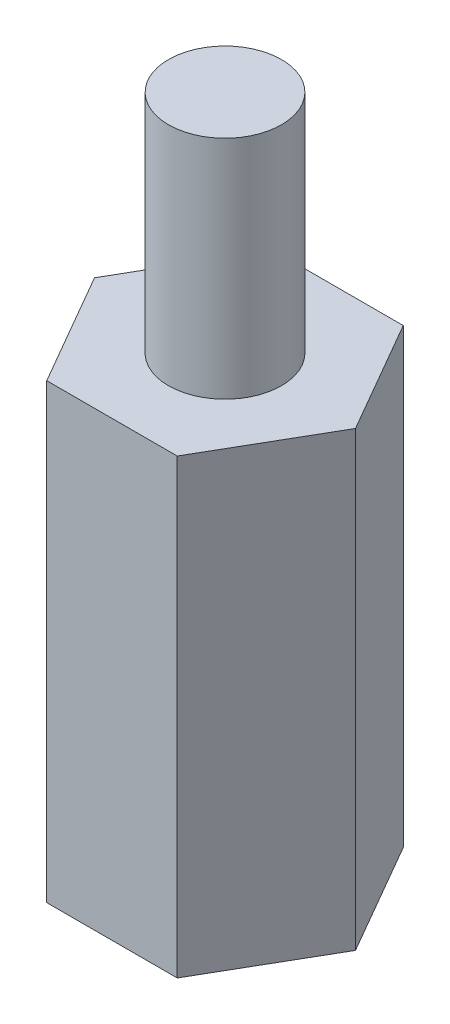
ISO-10303-21;
HEADER;
FILE_DESCRIPTION(('STEP AP214'),'2;1');
FILE_NAME('part.step','',(''),(''),'','','');
FILE_SCHEMA(('AUTOMOTIVE_DESIGN { 1 0 10303 214 1 1 1 1 }'));
ENDSEC;
DATA;
#1=APPLICATION_CONTEXT('core data for automotive mechanical design processes');
#2=APPLICATION_PROTOCOL_DEFINITION('international standard','automotive_design',2000,#1);
#3=PRODUCT_CONTEXT('',#1,'mechanical');
#4=PRODUCT('Part','Part','',(#3));
#5=PRODUCT_RELATED_PRODUCT_CATEGORY('part','',(#4));
#6=PRODUCT_DEFINITION_FORMATION('','',#4);
#7=PRODUCT_DEFINITION_CONTEXT('part definition',#1,'design');
#8=PRODUCT_DEFINITION('design','',#6,#7);
#9=PRODUCT_DEFINITION_SHAPE('','',#8);
#10=(LENGTH_UNIT() NAMED_UNIT(*) SI_UNIT(.MILLI.,.METRE.));
#11=(NAMED_UNIT(*) PLANE_ANGLE_UNIT() SI_UNIT($,.RADIAN.));
#12=(NAMED_UNIT(*) SI_UNIT($,.STERADIAN.) SOLID_ANGLE_UNIT());
#13=UNCERTAINTY_MEASURE_WITH_UNIT(LENGTH_MEASURE(1.E-05),#10,'distance_accuracy_value','');
#14=(GEOMETRIC_REPRESENTATION_CONTEXT(3) GLOBAL_UNCERTAINTY_ASSIGNED_CONTEXT((#13)) GLOBAL_UNIT_ASSIGNED_CONTEXT((#10,
#11,#12)) REPRESENTATION_CONTEXT('',''));
#15=CARTESIAN_POINT('',(0.,0.,0.));
#16=DIRECTION('',(0.,0.,1.));
#17=DIRECTION('',(1.,0.,0.));
#18=AXIS2_PLACEMENT_3D('',#15,#16,#17);
#19=CARTESIAN_POINT('',(2.88675134594813,10.,0.));
#20=DIRECTION('',(0.,1.,0.));
#21=DIRECTION('',(0.,0.,1.));
#22=AXIS2_PLACEMENT_3D('',#19,#20,#21);
#23=PLANE('',#22);
#24=DIRECTION('',(0.5,0.,-0.866025403784439));
#25=VECTOR('',#24,1.);
#26=CARTESIAN_POINT('',(1.44337567297407,10.,2.5));
#27=LINE('',#26,#25);
#28=CARTESIAN_POINT('',(1.44337567297407,10.,2.5));
#29=VERTEX_POINT('',#28);
#30=CARTESIAN_POINT('',(2.88675134594813,10.,0.));
#31=VERTEX_POINT('',#30);
#32=EDGE_CURVE('E135',#29,#31,#27,.T.);
#33=ORIENTED_EDGE('',*,*,#32,.T.);
#34=DIRECTION('',(-0.5,0.,-0.866025403784438));
#35=VECTOR('',#34,1.);
#36=CARTESIAN_POINT('',(2.88675134594813,10.,0.));
#37=LINE('',#36,#35);
#38=CARTESIAN_POINT('',(1.44337567297406,10.,-2.5));
#39=VERTEX_POINT('',#38);
#40=EDGE_CURVE('E92',#31,#39,#37,.T.);
#41=ORIENTED_EDGE('',*,*,#40,.T.);
#42=DIRECTION('',(-1.,0.,0.));
#43=VECTOR('',#42,1.);
#44=CARTESIAN_POINT('',(1.44337567297406,10.,-2.5));
#45=LINE('',#44,#43);
#46=CARTESIAN_POINT('',(-1.44337567297406,10.,-2.5));
#47=VERTEX_POINT('',#46);
#48=EDGE_CURVE('E106',#39,#47,#45,.T.);
#49=ORIENTED_EDGE('',*,*,#48,.T.);
#50=DIRECTION('',(-0.5,0.,0.866025403784439));
#51=VECTOR('',#50,1.);
#52=CARTESIAN_POINT('',(-1.44337567297406,10.,-2.5));
#53=LINE('',#52,#51);
#54=CARTESIAN_POINT('',(-2.88675134594813,10.,0.));
#55=VERTEX_POINT('',#54);
#56=EDGE_CURVE('E100',#47,#55,#53,.T.);
#57=ORIENTED_EDGE('',*,*,#56,.T.);
#58=DIRECTION('',(0.5,0.,0.866025403784439));
#59=VECTOR('',#58,1.);
#60=CARTESIAN_POINT('',(-2.88675134594813,10.,0.));
#61=LINE('',#60,#59);
#62=CARTESIAN_POINT('',(-1.44337567297406,10.,2.5));
#63=VERTEX_POINT('',#62);
#64=EDGE_CURVE('E104',#55,#63,#61,.T.);
#65=ORIENTED_EDGE('',*,*,#64,.T.);
#66=DIRECTION('',(1.,0.,0.));
#67=VECTOR('',#66,1.);
#68=CARTESIAN_POINT('',(-1.44337567297406,10.,2.5));
#69=LINE('',#68,#67);
#70=EDGE_CURVE('E54',#63,#29,#69,.T.);
#71=ORIENTED_EDGE('',*,*,#70,.T.);
#72=EDGE_LOOP('',(#33,#41,#49,#57,#65,#71));
#73=FACE_BOUND('',#72,.T.);
#74=CARTESIAN_POINT('',(0.,10.,0.));
#75=DIRECTION('',(0.,1.,0.));
#76=DIRECTION('',(0.,0.,1.));
#77=AXIS2_PLACEMENT_3D('',#74,#75,#76);
#78=CIRCLE('',#77,1.25);
#79=CARTESIAN_POINT('',(0.,10.,1.25));
#80=VERTEX_POINT('',#79);
#81=EDGE_CURVE('E186',#80,#80,#78,.T.);
#82=ORIENTED_EDGE('',*,*,#81,.F.);
#83=EDGE_LOOP('',(#82));
#84=FACE_BOUND('',#83,.T.);
#85=ADVANCED_FACE('F37',(#73,#84),#23,.T.);
#86=CARTESIAN_POINT('',(1.44337567297407,10.,2.5));
#87=DIRECTION('',(-0.866025403784439,0.,-0.5));
#88=DIRECTION('',(-0.5,0.,0.866025403784439));
#89=AXIS2_PLACEMENT_3D('',#86,#87,#88);
#90=PLANE('',#89);
#91=DIRECTION('',(0.5,0.,-0.866025403784439));
#92=VECTOR('',#91,1.);
#93=CARTESIAN_POINT('',(1.44337567297407,0.,2.5));
#94=LINE('',#93,#92);
#95=CARTESIAN_POINT('',(1.44337567297407,0.,2.5));
#96=VERTEX_POINT('',#95);
#97=CARTESIAN_POINT('',(2.88675134594813,0.,0.));
#98=VERTEX_POINT('',#97);
#99=EDGE_CURVE('E124',#96,#98,#94,.T.);
#100=ORIENTED_EDGE('',*,*,#99,.T.);
#101=DIRECTION('',(0.,-1.,0.));
#102=VECTOR('',#101,1.);
#103=CARTESIAN_POINT('',(2.88675134594813,10.,0.));
#104=LINE('',#103,#102);
#105=EDGE_CURVE('E11',#31,#98,#104,.T.);
#106=ORIENTED_EDGE('',*,*,#105,.F.);
#107=ORIENTED_EDGE('',*,*,#32,.F.);
#108=DIRECTION('',(0.,-1.,0.));
#109=VECTOR('',#108,1.);
#110=CARTESIAN_POINT('',(1.44337567297407,10.,2.5));
#111=LINE('',#110,#109);
#112=EDGE_CURVE('E120',#29,#96,#111,.T.);
#113=ORIENTED_EDGE('',*,*,#112,.T.);
#114=EDGE_LOOP('',(#100,#106,#107,#113));
#115=FACE_BOUND('',#114,.T.);
#116=ADVANCED_FACE('F39',(#115),#90,.F.);
#117=CARTESIAN_POINT('',(2.88675134594813,10.,0.));
#118=DIRECTION('',(-0.866025403784438,0.,0.5));
#119=DIRECTION('',(0.5,0.,0.866025403784438));
#120=AXIS2_PLACEMENT_3D('',#117,#118,#119);
#121=PLANE('',#120);
#122=DIRECTION('',(-0.5,0.,-0.866025403784438));
#123=VECTOR('',#122,1.);
#124=CARTESIAN_POINT('',(2.88675134594813,0.,0.));
#125=LINE('',#124,#123);
#126=CARTESIAN_POINT('',(1.44337567297406,0.,-2.5));
#127=VERTEX_POINT('',#126);
#128=EDGE_CURVE('E127',#98,#127,#125,.T.);
#129=ORIENTED_EDGE('',*,*,#128,.T.);
#130=DIRECTION('',(0.,-1.,0.));
#131=VECTOR('',#130,1.);
#132=CARTESIAN_POINT('',(1.44337567297406,10.,-2.5));
#133=LINE('',#132,#131);
#134=EDGE_CURVE('E46',#39,#127,#133,.T.);
#135=ORIENTED_EDGE('',*,*,#134,.F.);
#136=ORIENTED_EDGE('',*,*,#40,.F.);
#137=ORIENTED_EDGE('',*,*,#105,.T.);
#138=EDGE_LOOP('',(#129,#135,#136,#137));
#139=FACE_BOUND('',#138,.T.);
#140=ADVANCED_FACE('F164',(#139),#121,.F.);
#141=CARTESIAN_POINT('',(1.44337567297406,10.,-2.5));
#142=DIRECTION('',(0.,0.,1.));
#143=DIRECTION('',(1.,0.,0.));
#144=AXIS2_PLACEMENT_3D('',#141,#142,#143);
#145=PLANE('',#144);
#146=DIRECTION('',(-1.,0.,0.));
#147=VECTOR('',#146,1.);
#148=CARTESIAN_POINT('',(1.44337567297406,0.,-2.5));
#149=LINE('',#148,#147);
#150=CARTESIAN_POINT('',(-1.44337567297406,0.,-2.5));
#151=VERTEX_POINT('',#150);
#152=EDGE_CURVE('E130',#127,#151,#149,.T.);
#153=ORIENTED_EDGE('',*,*,#152,.T.);
#154=DIRECTION('',(0.,-1.,0.));
#155=VECTOR('',#154,1.);
#156=CARTESIAN_POINT('',(-1.44337567297406,10.,-2.5));
#157=LINE('',#156,#155);
#158=EDGE_CURVE('E115',#47,#151,#157,.T.);
#159=ORIENTED_EDGE('',*,*,#158,.F.);
#160=ORIENTED_EDGE('',*,*,#48,.F.);
#161=ORIENTED_EDGE('',*,*,#134,.T.);
#162=EDGE_LOOP('',(#153,#159,#160,#161));
#163=FACE_BOUND('',#162,.T.);
#164=ADVANCED_FACE('F141',(#163),#145,.F.);
#165=CARTESIAN_POINT('',(-1.44337567297406,10.,-2.5));
#166=DIRECTION('',(0.866025403784438,0.,0.5));
#167=DIRECTION('',(0.5,0.,-0.866025403784439));
#168=AXIS2_PLACEMENT_3D('',#165,#166,#167);
#169=PLANE('',#168);
#170=DIRECTION('',(-0.5,0.,0.866025403784439));
#171=VECTOR('',#170,1.);
#172=CARTESIAN_POINT('',(-1.44337567297406,0.,-2.5));
#173=LINE('',#172,#171);
#174=CARTESIAN_POINT('',(-2.88675134594813,0.,0.));
#175=VERTEX_POINT('',#174);
#176=EDGE_CURVE('E114',#151,#175,#173,.T.);
#177=ORIENTED_EDGE('',*,*,#176,.T.);
#178=DIRECTION('',(0.,-1.,0.));
#179=VECTOR('',#178,1.);
#180=CARTESIAN_POINT('',(-2.88675134594813,10.,0.));
#181=LINE('',#180,#179);
#182=EDGE_CURVE('E111',#55,#175,#181,.T.);
#183=ORIENTED_EDGE('',*,*,#182,.F.);
#184=ORIENTED_EDGE('',*,*,#56,.F.);
#185=ORIENTED_EDGE('',*,*,#158,.T.);
#186=EDGE_LOOP('',(#177,#183,#184,#185));
#187=FACE_BOUND('',#186,.T.);
#188=ADVANCED_FACE('F112',(#187),#169,.F.);
#189=CARTESIAN_POINT('',(-2.88675134594813,10.,0.));
#190=DIRECTION('',(0.866025403784438,0.,-0.5));
#191=DIRECTION('',(-0.5,0.,-0.866025403784439));
#192=AXIS2_PLACEMENT_3D('',#189,#190,#191);
#193=PLANE('',#192);
#194=DIRECTION('',(0.5,0.,0.866025403784439));
#195=VECTOR('',#194,1.);
#196=CARTESIAN_POINT('',(-2.88675134594813,0.,0.));
#197=LINE('',#196,#195);
#198=CARTESIAN_POINT('',(-1.44337567297406,0.,2.5));
#199=VERTEX_POINT('',#198);
#200=EDGE_CURVE('E78',#175,#199,#197,.T.);
#201=ORIENTED_EDGE('',*,*,#200,.T.);
#202=DIRECTION('',(0.,-1.,0.));
#203=VECTOR('',#202,1.);
#204=CARTESIAN_POINT('',(-1.44337567297406,10.,2.5));
#205=LINE('',#204,#203);
#206=EDGE_CURVE('E116',#63,#199,#205,.T.);
#207=ORIENTED_EDGE('',*,*,#206,.F.);
#208=ORIENTED_EDGE('',*,*,#64,.F.);
#209=ORIENTED_EDGE('',*,*,#182,.T.);
#210=EDGE_LOOP('',(#201,#207,#208,#209));
#211=FACE_BOUND('',#210,.T.);
#212=ADVANCED_FACE('F118',(#211),#193,.F.);
#213=CARTESIAN_POINT('',(-1.44337567297406,10.,2.5));
#214=DIRECTION('',(0.,0.,-1.));
#215=DIRECTION('',(-1.,0.,0.));
#216=AXIS2_PLACEMENT_3D('',#213,#214,#215);
#217=PLANE('',#216);
#218=DIRECTION('',(1.,0.,0.));
#219=VECTOR('',#218,1.);
#220=CARTESIAN_POINT('',(-1.44337567297406,0.,2.5));
#221=LINE('',#220,#219);
#222=EDGE_CURVE('E84',#199,#96,#221,.T.);
#223=ORIENTED_EDGE('',*,*,#222,.T.);
#224=ORIENTED_EDGE('',*,*,#112,.F.);
#225=ORIENTED_EDGE('',*,*,#70,.F.);
#226=ORIENTED_EDGE('',*,*,#206,.T.);
#227=EDGE_LOOP('',(#223,#224,#225,#226));
#228=FACE_BOUND('',#227,.T.);
#229=ADVANCED_FACE('F148',(#228),#217,.F.);
#230=CARTESIAN_POINT('',(2.88675134594813,0.,0.));
#231=DIRECTION('',(0.,1.,0.));
#232=DIRECTION('',(0.,0.,1.));
#233=AXIS2_PLACEMENT_3D('',#230,#231,#232);
#234=PLANE('',#233);
#235=CARTESIAN_POINT('',(0.,0.,0.));
#236=DIRECTION('',(0.,-1.,0.));
#237=DIRECTION('',(0.,0.,-1.));
#238=AXIS2_PLACEMENT_3D('',#235,#236,#237);
#239=CIRCLE('',#238,1.25);
#240=CARTESIAN_POINT('',(0.,0.,-1.25));
#241=VERTEX_POINT('',#240);
#242=EDGE_CURVE('E185',#241,#241,#239,.T.);
#243=ORIENTED_EDGE('',*,*,#242,.F.);
#244=EDGE_LOOP('',(#243));
#245=FACE_BOUND('',#244,.T.);
#246=ORIENTED_EDGE('',*,*,#99,.F.);
#247=ORIENTED_EDGE('',*,*,#222,.F.);
#248=ORIENTED_EDGE('',*,*,#200,.F.);
#249=ORIENTED_EDGE('',*,*,#176,.F.);
#250=ORIENTED_EDGE('',*,*,#152,.F.);
#251=ORIENTED_EDGE('',*,*,#128,.F.);
#252=EDGE_LOOP('',(#246,#247,#248,#249,#250,#251));
#253=FACE_BOUND('',#252,.T.);
#254=ADVANCED_FACE('F144',(#245,#253),#234,.F.);
#255=CARTESIAN_POINT('',(0.,7.5,0.));
#256=DIRECTION('',(0.,-1.,0.));
#257=DIRECTION('',(0.,0.,-1.));
#258=AXIS2_PLACEMENT_3D('',#255,#256,#257);
#259=CONICAL_SURFACE('',#258,1.25,1.02974425867665);
#260=CARTESIAN_POINT('',(0.,8.25107577378445,0.));
#261=VERTEX_POINT('',#260);
#262=VERTEX_LOOP('',#261);
#263=FACE_BOUND('',#262,.T.);
#264=CARTESIAN_POINT('',(0.,7.5,0.));
#265=DIRECTION('',(0.,-1.,0.));
#266=DIRECTION('',(0.,0.,-1.));
#267=AXIS2_PLACEMENT_3D('',#264,#265,#266);
#268=CIRCLE('',#267,1.25);
#269=CARTESIAN_POINT('',(0.,7.5,-1.25));
#270=VERTEX_POINT('',#269);
#271=EDGE_CURVE('E128',#270,#270,#268,.T.);
#272=ORIENTED_EDGE('',*,*,#271,.T.);
#273=EDGE_LOOP('',(#272));
#274=FACE_BOUND('',#273,.T.);
#275=ADVANCED_FACE('F155',(#263,#274),#259,.F.);
#276=CARTESIAN_POINT('',(0.,0.,0.));
#277=DIRECTION('',(0.,-1.,0.));
#278=DIRECTION('',(0.,0.,-1.));
#279=AXIS2_PLACEMENT_3D('',#276,#277,#278);
#280=CYLINDRICAL_SURFACE('',#279,1.25);
#281=ORIENTED_EDGE('',*,*,#271,.F.);
#282=EDGE_LOOP('',(#281));
#283=FACE_BOUND('',#282,.T.);
#284=ORIENTED_EDGE('',*,*,#242,.T.);
#285=EDGE_LOOP('',(#284));
#286=FACE_BOUND('',#285,.T.);
#287=ADVANCED_FACE('F168',(#283,#286),#280,.F.);
#288=CARTESIAN_POINT('',(0.,15.,0.));
#289=DIRECTION('',(0.,-1.,0.));
#290=DIRECTION('',(0.,0.,-1.));
#291=AXIS2_PLACEMENT_3D('',#288,#289,#290);
#292=CYLINDRICAL_SURFACE('',#291,1.25);
#293=CARTESIAN_POINT('',(0.,15.,0.));
#294=DIRECTION('',(0.,1.,0.));
#295=DIRECTION('',(0.,0.,1.));
#296=AXIS2_PLACEMENT_3D('',#293,#294,#295);
#297=CIRCLE('',#296,1.25);
#298=CARTESIAN_POINT('',(0.,15.,1.25));
#299=VERTEX_POINT('',#298);
#300=EDGE_CURVE('E184',#299,#299,#297,.T.);
#301=ORIENTED_EDGE('',*,*,#300,.F.);
#302=EDGE_LOOP('',(#301));
#303=FACE_BOUND('',#302,.T.);
#304=ORIENTED_EDGE('',*,*,#81,.T.);
#305=EDGE_LOOP('',(#304));
#306=FACE_BOUND('',#305,.T.);
#307=ADVANCED_FACE('F172',(#303,#306),#292,.T.);
#308=CARTESIAN_POINT('',(0.,15.,0.));
#309=DIRECTION('',(0.,1.,0.));
#310=DIRECTION('',(0.,0.,1.));
#311=AXIS2_PLACEMENT_3D('',#308,#309,#310);
#312=PLANE('',#311);
#313=ORIENTED_EDGE('',*,*,#300,.T.);
#314=EDGE_LOOP('',(#313));
#315=FACE_BOUND('',#314,.T.);
#316=ADVANCED_FACE('F176',(#315),#312,.T.);
#317=CLOSED_SHELL('',(#85,#116,#140,#164,#188,#212,#229,#254,#275,#287,#307,#316));
#318=MANIFOLD_SOLID_BREP('B2',#317);
#319=ADVANCED_BREP_SHAPE_REPRESENTATION('',(#18,#318),#14);
#320=SHAPE_DEFINITION_REPRESENTATION(#9,#319);
ENDSEC;
END-ISO-10303-21;
